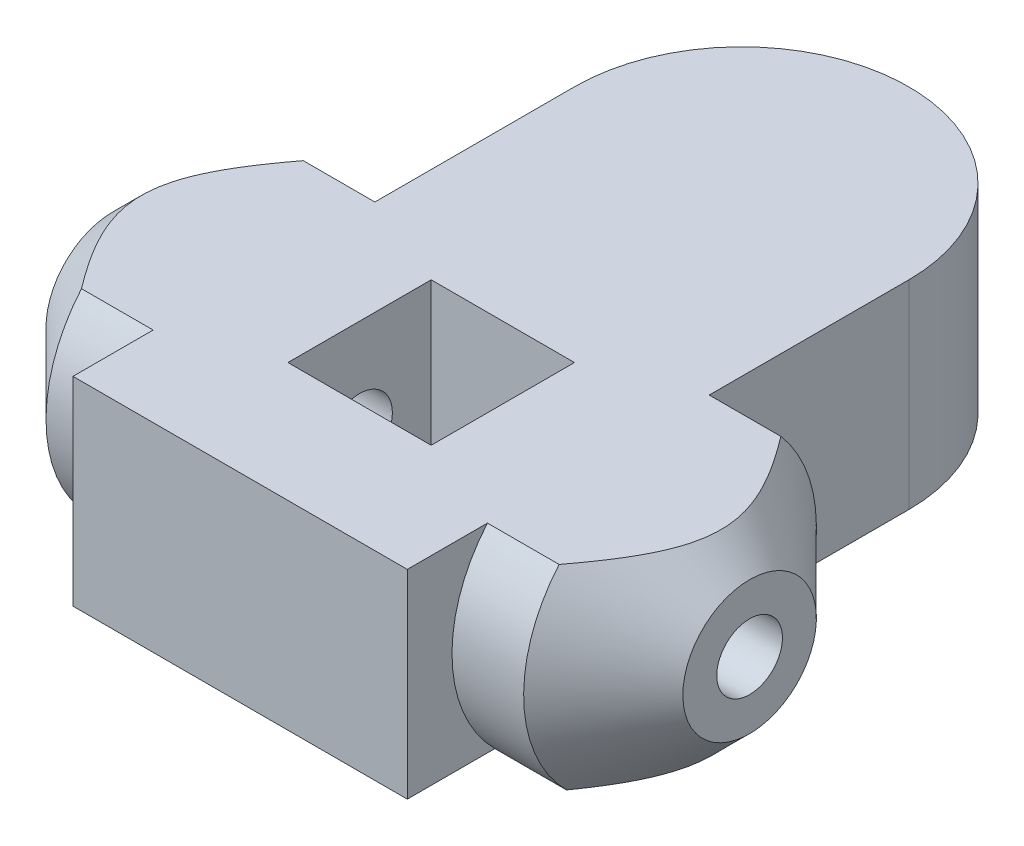
ISO-10303-21;
HEADER;
FILE_DESCRIPTION(('STEP AP214'),'2;1');
FILE_NAME('part.step','',(''),(''),'','','');
FILE_SCHEMA(('AUTOMOTIVE_DESIGN { 1 0 10303 214 1 1 1 1 }'));
ENDSEC;
DATA;
#1=APPLICATION_CONTEXT('core data for automotive mechanical design processes');
#2=APPLICATION_PROTOCOL_DEFINITION('international standard','automotive_design',2000,#1);
#3=PRODUCT_CONTEXT('',#1,'mechanical');
#4=PRODUCT('Part','Part','',(#3));
#5=PRODUCT_RELATED_PRODUCT_CATEGORY('part','',(#4));
#6=PRODUCT_DEFINITION_FORMATION('','',#4);
#7=PRODUCT_DEFINITION_CONTEXT('part definition',#1,'design');
#8=PRODUCT_DEFINITION('design','',#6,#7);
#9=PRODUCT_DEFINITION_SHAPE('','',#8);
#10=(LENGTH_UNIT() NAMED_UNIT(*) SI_UNIT(.MILLI.,.METRE.));
#11=(NAMED_UNIT(*) PLANE_ANGLE_UNIT() SI_UNIT($,.RADIAN.));
#12=(NAMED_UNIT(*) SI_UNIT($,.STERADIAN.) SOLID_ANGLE_UNIT());
#13=UNCERTAINTY_MEASURE_WITH_UNIT(LENGTH_MEASURE(1.E-05),#10,'distance_accuracy_value','');
#14=(GEOMETRIC_REPRESENTATION_CONTEXT(3) GLOBAL_UNCERTAINTY_ASSIGNED_CONTEXT((#13)) GLOBAL_UNIT_ASSIGNED_CONTEXT((#10,
#11,#12)) REPRESENTATION_CONTEXT('',''));
#15=CARTESIAN_POINT('',(0.,0.,0.));
#16=DIRECTION('',(0.,0.,1.));
#17=DIRECTION('',(1.,0.,0.));
#18=AXIS2_PLACEMENT_3D('',#15,#16,#17);
#19=CARTESIAN_POINT('',(21.,-13.,24.));
#20=DIRECTION('',(1.,0.,0.));
#21=DIRECTION('',(0.,0.,-1.));
#22=AXIS2_PLACEMENT_3D('',#19,#20,#21);
#23=PLANE('',#22);
#24=DIRECTION('',(0.,0.,-1.));
#25=VECTOR('',#24,1.);
#26=CARTESIAN_POINT('',(21.,12.,24.));
#27=LINE('',#26,#25);
#28=CARTESIAN_POINT('',(21.,12.,-13.9283882771844));
#29=VERTEX_POINT('',#28);
#30=CARTESIAN_POINT('',(21.,12.,-39.));
#31=VERTEX_POINT('',#30);
#32=EDGE_CURVE('E250',#29,#31,#27,.T.);
#33=ORIENTED_EDGE('',*,*,#32,.F.);
#34=CARTESIAN_POINT('',(21.,0.,0.));
#35=DIRECTION('',(1.,0.,0.));
#36=DIRECTION('',(0.,0.,-1.));
#37=AXIS2_PLACEMENT_3D('',#34,#35,#36);
#38=CIRCLE('',#37,18.3847763108505);
#39=CARTESIAN_POINT('',(21.,-13.,-13.0000000000003));
#40=VERTEX_POINT('',#39);
#41=EDGE_CURVE('E246',#29,#40,#38,.F.);
#42=ORIENTED_EDGE('',*,*,#41,.T.);
#43=DIRECTION('',(0.,0.,-1.));
#44=VECTOR('',#43,1.);
#45=CARTESIAN_POINT('',(21.,-13.,24.));
#46=LINE('',#45,#44);
#47=CARTESIAN_POINT('',(21.,-13.,-39.));
#48=VERTEX_POINT('',#47);
#49=EDGE_CURVE('E268',#40,#48,#46,.T.);
#50=ORIENTED_EDGE('',*,*,#49,.T.);
#51=DIRECTION('',(0.,1.,0.));
#52=VECTOR('',#51,1.);
#53=CARTESIAN_POINT('',(21.,-13.,-39.));
#54=LINE('',#53,#52);
#55=EDGE_CURVE('E286',#48,#31,#54,.T.);
#56=ORIENTED_EDGE('',*,*,#55,.T.);
#57=EDGE_LOOP('',(#33,#42,#50,#56));
#58=FACE_BOUND('',#57,.T.);
#59=ADVANCED_FACE('F43',(#58),#23,.T.);
#60=CARTESIAN_POINT('',(-21.,-13.,24.));
#61=DIRECTION('',(-1.,0.,0.));
#62=DIRECTION('',(0.,0.,1.));
#63=AXIS2_PLACEMENT_3D('',#60,#61,#62);
#64=PLANE('',#63);
#65=DIRECTION('',(0.,0.,1.));
#66=VECTOR('',#65,1.);
#67=CARTESIAN_POINT('',(-21.,-13.,24.));
#68=LINE('',#67,#66);
#69=CARTESIAN_POINT('',(-21.,-13.,-39.));
#70=VERTEX_POINT('',#69);
#71=CARTESIAN_POINT('',(-21.,-13.,-13.0000000000003));
#72=VERTEX_POINT('',#71);
#73=EDGE_CURVE('E278',#70,#72,#68,.T.);
#74=ORIENTED_EDGE('',*,*,#73,.T.);
#75=CARTESIAN_POINT('',(-21.,0.,0.));
#76=DIRECTION('',(-1.,0.,0.));
#77=DIRECTION('',(0.,0.,1.));
#78=AXIS2_PLACEMENT_3D('',#75,#76,#77);
#79=CIRCLE('',#78,18.3847763108505);
#80=CARTESIAN_POINT('',(-21.,12.,-13.9283882771844));
#81=VERTEX_POINT('',#80);
#82=EDGE_CURVE('E242',#72,#81,#79,.F.);
#83=ORIENTED_EDGE('',*,*,#82,.T.);
#84=DIRECTION('',(0.,0.,1.));
#85=VECTOR('',#84,1.);
#86=CARTESIAN_POINT('',(-21.,12.,24.));
#87=LINE('',#86,#85);
#88=CARTESIAN_POINT('',(-21.,12.,-39.));
#89=VERTEX_POINT('',#88);
#90=EDGE_CURVE('E260',#89,#81,#87,.T.);
#91=ORIENTED_EDGE('',*,*,#90,.F.);
#92=DIRECTION('',(0.,1.,0.));
#93=VECTOR('',#92,1.);
#94=CARTESIAN_POINT('',(-21.,-13.,-39.));
#95=LINE('',#94,#93);
#96=EDGE_CURVE('E294',#70,#89,#95,.T.);
#97=ORIENTED_EDGE('',*,*,#96,.F.);
#98=EDGE_LOOP('',(#74,#83,#91,#97));
#99=FACE_BOUND('',#98,.T.);
#100=ADVANCED_FACE('F345',(#99),#64,.T.);
#101=CARTESIAN_POINT('',(21.,-13.,24.));
#102=VERTEX_POINT('',#101);
#103=CARTESIAN_POINT('',(21.,-13.,13.0000000000003));
#104=VERTEX_POINT('',#103);
#105=EDGE_CURVE('E269',#102,#104,#46,.T.);
#106=ORIENTED_EDGE('',*,*,#105,.T.);
#107=CARTESIAN_POINT('',(21.,0.,0.));
#108=DIRECTION('',(1.,0.,0.));
#109=DIRECTION('',(0.,0.,-1.));
#110=AXIS2_PLACEMENT_3D('',#107,#108,#109);
#111=CIRCLE('',#110,18.3847763108505);
#112=CARTESIAN_POINT('',(21.,12.,13.9283882771844));
#113=VERTEX_POINT('',#112);
#114=EDGE_CURVE('E238',#104,#113,#111,.F.);
#115=ORIENTED_EDGE('',*,*,#114,.T.);
#116=CARTESIAN_POINT('',(21.,12.,24.));
#117=VERTEX_POINT('',#116);
#118=EDGE_CURVE('E251',#117,#113,#27,.T.);
#119=ORIENTED_EDGE('',*,*,#118,.F.);
#120=DIRECTION('',(0.,1.,0.));
#121=VECTOR('',#120,1.);
#122=CARTESIAN_POINT('',(21.,-13.,24.));
#123=LINE('',#122,#121);
#124=EDGE_CURVE('E287',#102,#117,#123,.T.);
#125=ORIENTED_EDGE('',*,*,#124,.F.);
#126=EDGE_LOOP('',(#106,#115,#119,#125));
#127=FACE_BOUND('',#126,.T.);
#128=ADVANCED_FACE('F340',(#127),#23,.T.);
#129=CARTESIAN_POINT('',(-21.,-13.,24.));
#130=DIRECTION('',(0.,0.,1.));
#131=DIRECTION('',(1.,0.,0.));
#132=AXIS2_PLACEMENT_3D('',#129,#130,#131);
#133=PLANE('',#132);
#134=ORIENTED_EDGE('',*,*,#124,.T.);
#135=DIRECTION('',(1.,0.,0.));
#136=VECTOR('',#135,1.);
#137=CARTESIAN_POINT('',(-21.,12.,24.));
#138=LINE('',#137,#136);
#139=CARTESIAN_POINT('',(-21.,12.,24.));
#140=VERTEX_POINT('',#139);
#141=EDGE_CURVE('E264',#140,#117,#138,.T.);
#142=ORIENTED_EDGE('',*,*,#141,.F.);
#143=DIRECTION('',(0.,1.,0.));
#144=VECTOR('',#143,1.);
#145=CARTESIAN_POINT('',(-21.,-13.,24.));
#146=LINE('',#145,#144);
#147=CARTESIAN_POINT('',(-21.,-13.,24.));
#148=VERTEX_POINT('',#147);
#149=EDGE_CURVE('E290',#148,#140,#146,.T.);
#150=ORIENTED_EDGE('',*,*,#149,.F.);
#151=DIRECTION('',(1.,0.,0.));
#152=VECTOR('',#151,1.);
#153=CARTESIAN_POINT('',(-21.,-13.,24.));
#154=LINE('',#153,#152);
#155=EDGE_CURVE('E282',#148,#102,#154,.T.);
#156=ORIENTED_EDGE('',*,*,#155,.T.);
#157=EDGE_LOOP('',(#134,#142,#150,#156));
#158=FACE_BOUND('',#157,.T.);
#159=ADVANCED_FACE('F335',(#158),#133,.T.);
#160=CARTESIAN_POINT('',(-21.,12.,13.9283882771844));
#161=VERTEX_POINT('',#160);
#162=EDGE_CURVE('E259',#161,#140,#87,.T.);
#163=ORIENTED_EDGE('',*,*,#162,.F.);
#164=CARTESIAN_POINT('',(-21.,0.,0.));
#165=DIRECTION('',(-1.,0.,0.));
#166=DIRECTION('',(0.,0.,1.));
#167=AXIS2_PLACEMENT_3D('',#164,#165,#166);
#168=CIRCLE('',#167,18.3847763108505);
#169=CARTESIAN_POINT('',(-21.,-13.,13.0000000000003));
#170=VERTEX_POINT('',#169);
#171=EDGE_CURVE('E234',#161,#170,#168,.F.);
#172=ORIENTED_EDGE('',*,*,#171,.T.);
#173=EDGE_CURVE('E277',#170,#148,#68,.T.);
#174=ORIENTED_EDGE('',*,*,#173,.T.);
#175=ORIENTED_EDGE('',*,*,#149,.T.);
#176=EDGE_LOOP('',(#163,#172,#174,#175));
#177=FACE_BOUND('',#176,.T.);
#178=ADVANCED_FACE('F339',(#177),#64,.T.);
#179=CARTESIAN_POINT('',(0.,-13.,-39.));
#180=DIRECTION('',(0.,1.,0.));
#181=DIRECTION('',(0.,0.,1.));
#182=AXIS2_PLACEMENT_3D('',#179,#180,#181);
#183=CYLINDRICAL_SURFACE('',#182,21.);
#184=ORIENTED_EDGE('',*,*,#96,.T.);
#185=CARTESIAN_POINT('',(0.,12.,-39.));
#186=DIRECTION('',(0.,1.,0.));
#187=DIRECTION('',(0.,0.,1.));
#188=AXIS2_PLACEMENT_3D('',#185,#186,#187);
#189=CIRCLE('',#188,21.);
#190=EDGE_CURVE('E255',#31,#89,#189,.T.);
#191=ORIENTED_EDGE('',*,*,#190,.F.);
#192=ORIENTED_EDGE('',*,*,#55,.F.);
#193=CARTESIAN_POINT('',(0.,-13.,-39.));
#194=DIRECTION('',(0.,1.,0.));
#195=DIRECTION('',(0.,0.,1.));
#196=AXIS2_PLACEMENT_3D('',#193,#194,#195);
#197=CIRCLE('',#196,21.);
#198=EDGE_CURVE('E273',#48,#70,#197,.T.);
#199=ORIENTED_EDGE('',*,*,#198,.T.);
#200=EDGE_LOOP('',(#184,#191,#192,#199));
#201=FACE_BOUND('',#200,.T.);
#202=ADVANCED_FACE('F331',(#201),#183,.T.);
#203=CARTESIAN_POINT('',(0.,-13.,-39.));
#204=DIRECTION('',(0.,1.,0.));
#205=DIRECTION('',(0.,0.,1.));
#206=AXIS2_PLACEMENT_3D('',#203,#204,#205);
#207=PLANE('',#206);
#208=DIRECTION('',(-1.,0.,0.));
#209=VECTOR('',#208,1.);
#210=CARTESIAN_POINT('',(40.,-13.,-13.0000000000003));
#211=LINE('',#210,#209);
#212=CARTESIAN_POINT('',(29.9999999999999,-13.,-13.0000000000003));
#213=VERTEX_POINT('',#212);
#214=EDGE_CURVE('E231',#213,#40,#211,.T.);
#215=ORIENTED_EDGE('',*,*,#214,.F.);
#216=CARTESIAN_POINT('',(29.9999999999999,-13.,-13.0000000000003));
#217=CARTESIAN_POINT('',(30.1285065276517,-13.,-12.8182597189329));
#218=CARTESIAN_POINT('',(30.2561191394999,-13.,-12.6358879881555));
#219=CARTESIAN_POINT('',(30.5093773033593,-13.,-12.2697752499743));
#220=CARTESIAN_POINT('',(30.6350227896832,-13.,-12.0860341971464));
#221=CARTESIAN_POINT('',(31.0088314586741,-13.,-11.5324609145168));
#222=CARTESIAN_POINT('',(31.25375870935,-13.,-11.1604308949106));
#223=CARTESIAN_POINT('',(31.7361176955759,-13.,-10.4049705309283));
#224=CARTESIAN_POINT('',(31.9734177958351,-13.,-10.0214558630709));
#225=CARTESIAN_POINT('',(32.434786671612,-13.,-9.24657087540727));
#226=CARTESIAN_POINT('',(32.6588569652249,-13.,-8.85520146385075));
#227=CARTESIAN_POINT('',(33.0972296574377,-13.,-8.05145926409717));
#228=CARTESIAN_POINT('',(33.3110280144749,-13.,-7.63880966368275));
#229=CARTESIAN_POINT('',(33.7169680193847,-13.,-6.80280341373876));
#230=CARTESIAN_POINT('',(33.9091055590851,-13.,-6.37944475171703));
#231=CARTESIAN_POINT('',(34.2653689538084,-13.,-5.5234328995457));
#232=CARTESIAN_POINT('',(34.4296285970587,-13.,-5.09083600712471));
#233=CARTESIAN_POINT('',(34.7248824018153,-13.,-4.21456694695074));
#234=CARTESIAN_POINT('',(34.8558974367147,-13.,-3.77090192175787));
#235=CARTESIAN_POINT('',(35.0721635116771,-13.,-2.89739823079814));
#236=CARTESIAN_POINT('',(35.1594760737891,-13.,-2.46807725247808));
#237=CARTESIAN_POINT('',(35.2932960724229,-13.,-1.60290967781661));
#238=CARTESIAN_POINT('',(35.339795553934,-13.,-1.16706182613114));
#239=CARTESIAN_POINT('',(35.3884285530722,-13.,-0.299511233579166));
#240=CARTESIAN_POINT('',(35.3912263445886,-13.,0.132153675850127));
#241=CARTESIAN_POINT('',(35.3539653839037,-13.,0.993617129648628));
#242=CARTESIAN_POINT('',(35.3139047439034,-13.,1.4234155909685));
#243=CARTESIAN_POINT('',(35.1941616930827,-13.,2.27329484614641));
#244=CARTESIAN_POINT('',(35.1148480232691,-13.,2.69342870143072));
#245=CARTESIAN_POINT('',(34.9212917633065,-13.,3.52552312895587));
#246=CARTESIAN_POINT('',(34.8070457320013,-13.,3.93748289171462));
#247=CARTESIAN_POINT('',(34.6122099236903,-13.,4.55218551983212));
#248=CARTESIAN_POINT('',(34.5425733767573,-13.,4.75849754536857));
#249=CARTESIAN_POINT('',(34.3962800184364,-13.,5.1686278913515));
#250=CARTESIAN_POINT('',(34.3196231449197,-13.,5.37244618971079));
#251=CARTESIAN_POINT('',(34.1599767872289,-13.,5.77750552196208));
#252=CARTESIAN_POINT('',(34.0769892410351,-13.,5.97874732273005));
#253=CARTESIAN_POINT('',(33.9052786063024,-13.,6.3787509955619));
#254=CARTESIAN_POINT('',(33.8165557320282,-13.,6.57751295993887));
#255=CARTESIAN_POINT('',(33.5294012641891,-13.,7.19885745995095));
#256=CARTESIAN_POINT('',(33.3216612602138,-13.,7.61715698391067));
#257=CARTESIAN_POINT('',(32.8872050825841,-13.,8.4438375633031));
#258=CARTESIAN_POINT('',(32.6604827700448,-13.,8.85221535452713));
#259=CARTESIAN_POINT('',(32.1915943753494,-13.,9.6606245379244));
#260=CARTESIAN_POINT('',(31.9494100426597,-13.,10.060645298501));
#261=CARTESIAN_POINT('',(31.4528249235434,-13.,10.852936114874));
#262=CARTESIAN_POINT('',(31.1984253950053,-13.,11.2452069628889));
#263=CARTESIAN_POINT('',(30.6780668395618,-13.,12.0254970685278));
#264=CARTESIAN_POINT('',(30.4120459998478,-13.,12.4134749708161));
#265=CARTESIAN_POINT('',(29.871734856942,-13.,13.1836252806064));
#266=CARTESIAN_POINT('',(29.5974443770057,-13.,13.5657975637638));
#267=CARTESIAN_POINT('',(29.0421934710175,-13.,14.324889067061));
#268=CARTESIAN_POINT('',(28.7612373175356,-13.,14.7018114188381));
#269=CARTESIAN_POINT('',(28.1936086903415,-13.,15.4513121796751));
#270=CARTESIAN_POINT('',(27.9069362726914,-13.,15.823890631281));
#271=CARTESIAN_POINT('',(27.1058742559966,-13.,16.8511449925003));
#272=CARTESIAN_POINT('',(26.5863455469389,-13.,17.5018134866228));
#273=CARTESIAN_POINT('',(25.5358621900755,-13.,18.7939907504809));
#274=CARTESIAN_POINT('',(25.0049057283033,-13.,19.4354980387389));
#275=CARTESIAN_POINT('',(23.9412475518227,-13.,20.7027324429161));
#276=CARTESIAN_POINT('',(23.4086607280156,-13.,21.3285561282289));
#277=CARTESIAN_POINT('',(22.6047744405739,-13.,22.2628291625251));
#278=CARTESIAN_POINT('',(22.336013517469,-13.,22.5734693801987));
#279=CARTESIAN_POINT('',(21.7969702747539,-13.,23.193422344516));
#280=CARTESIAN_POINT('',(21.526687968761,-13.,23.5027351029977));
#281=CARTESIAN_POINT('',(21.2557274587989,-13.,23.8114529505655));
#282=B_SPLINE_CURVE_WITH_KNOTS('',3,(#216,#217,#218,#219,#220,#221,#222,#223,#224,#225,#226,
#227,#228,#229,#230,#231,#232,#233,#234,#235,#236,#237,#238,#239,#240,#241,#242,#243,#244,#245,
#246,#247,#248,#249,#250,#251,#252,#253,#254,#255,#256,#257,#258,#259,#260,#261,#262,#263,#264,
#265,#266,#267,#268,#269,#270,#271,#272,#273,#274,#275,#276,#277,#278,#279,#280,#281),
.UNSPECIFIED.,.F.,.F.,(4,2,2,2,2,2,2,2,2,2,2,2,2,2,2,2,2,2,2,2,2,2,2,2,2,2,2,2,2,2,2,2,4),(0.,
0.6677458241089,1.3355138985977,2.67161037119007,4.02437580430976,5.37698570725998,
6.77071615122797,8.16471048581235,9.55181318455473,10.9380427917938,12.2506259450982,
13.5634648814914,14.8563286615979,16.1492493912349,17.4302486617139,18.7113741629812,
19.3645139033757,20.0176594245113,20.6706057973688,21.3235277910247,22.7239767705443,
24.1248804182047,25.527469333509,26.9299141223922,28.3410412304497,29.7521985194937,
31.1624744974749,32.5727366509941,35.0704490711234,37.5685609291691,40.0338025046588,
41.2661006609545,42.4983878048957),.UNSPECIFIED.);
#283=CARTESIAN_POINT('',(30.,-13.,13.0000000000003));
#284=VERTEX_POINT('',#283);
#285=EDGE_CURVE('E319',#213,#284,#282,.T.);
#286=ORIENTED_EDGE('',*,*,#285,.T.);
#287=DIRECTION('',(-1.,0.,0.));
#288=VECTOR('',#287,1.);
#289=CARTESIAN_POINT('',(40.,-13.,13.0000000000003));
#290=LINE('',#289,#288);
#291=EDGE_CURVE('E219',#284,#104,#290,.T.);
#292=ORIENTED_EDGE('',*,*,#291,.T.);
#293=ORIENTED_EDGE('',*,*,#105,.F.);
#294=ORIENTED_EDGE('',*,*,#155,.F.);
#295=ORIENTED_EDGE('',*,*,#173,.F.);
#296=CARTESIAN_POINT('',(-30.,-13.,13.0000000000003));
#297=VERTEX_POINT('',#296);
#298=EDGE_CURVE('E213',#170,#297,#290,.T.);
#299=ORIENTED_EDGE('',*,*,#298,.T.);
#300=CARTESIAN_POINT('',(-30.,-13.,13.0000000000003));
#301=CARTESIAN_POINT('',(-30.1285065276517,-13.,12.8182597189329));
#302=CARTESIAN_POINT('',(-30.2561191394999,-13.,12.6358879881555));
#303=CARTESIAN_POINT('',(-30.5093773033593,-13.,12.2697752499743));
#304=CARTESIAN_POINT('',(-30.6350227896832,-13.,12.0860341971464));
#305=CARTESIAN_POINT('',(-31.0088314586742,-13.,11.5324609145168));
#306=CARTESIAN_POINT('',(-31.2537587093501,-13.,11.1604308949106));
#307=CARTESIAN_POINT('',(-31.736117695576,-13.,10.4049705309283));
#308=CARTESIAN_POINT('',(-31.9734177958352,-13.,10.0214558630709));
#309=CARTESIAN_POINT('',(-32.434786671612,-13.,9.24657087540727));
#310=CARTESIAN_POINT('',(-32.6588569652249,-13.,8.85520146385074));
#311=CARTESIAN_POINT('',(-33.0972296574378,-13.,8.05145926409716));
#312=CARTESIAN_POINT('',(-33.3110280144749,-13.,7.63880966368274));
#313=CARTESIAN_POINT('',(-33.7169680193848,-13.,6.80280341373876));
#314=CARTESIAN_POINT('',(-33.9091055590851,-13.,6.37944475171703));
#315=CARTESIAN_POINT('',(-34.2653689538085,-13.,5.5234328995457));
#316=CARTESIAN_POINT('',(-34.4296285970587,-13.,5.09083600712472));
#317=CARTESIAN_POINT('',(-34.7248824018154,-13.,4.21456694695074));
#318=CARTESIAN_POINT('',(-34.8558974367148,-13.,3.77090192175788));
#319=CARTESIAN_POINT('',(-35.0721635116772,-13.,2.89739823079814));
#320=CARTESIAN_POINT('',(-35.1594760737891,-13.,2.46807725247808));
#321=CARTESIAN_POINT('',(-35.293296072423,-13.,1.60290967781661));
#322=CARTESIAN_POINT('',(-35.3397955539341,-13.,1.16706182613113));
#323=CARTESIAN_POINT('',(-35.3884285530723,-13.,0.299511233579154));
#324=CARTESIAN_POINT('',(-35.3912263445886,-13.,-0.132153675850141));
#325=CARTESIAN_POINT('',(-35.3539653839037,-13.,-0.993617129648646));
#326=CARTESIAN_POINT('',(-35.3139047439035,-13.,-1.42341559096852));
#327=CARTESIAN_POINT('',(-35.1941616930827,-13.,-2.27329484614644));
#328=CARTESIAN_POINT('',(-35.1148480232691,-13.,-2.69342870143075));
#329=CARTESIAN_POINT('',(-34.9212917633065,-13.,-3.5255231289559));
#330=CARTESIAN_POINT('',(-34.8070457320013,-13.,-3.93748289171466));
#331=CARTESIAN_POINT('',(-34.6122099236903,-13.,-4.55218551983215));
#332=CARTESIAN_POINT('',(-34.5425733767573,-13.,-4.75849754536861));
#333=CARTESIAN_POINT('',(-34.3962800184364,-13.,-5.16862789135154));
#334=CARTESIAN_POINT('',(-34.3196231449197,-13.,-5.37244618971083));
#335=CARTESIAN_POINT('',(-34.1599767872289,-13.,-5.77750552196212));
#336=CARTESIAN_POINT('',(-34.0769892410352,-13.,-5.97874732273009));
#337=CARTESIAN_POINT('',(-33.9052786063024,-13.,-6.37875099556194));
#338=CARTESIAN_POINT('',(-33.8165557320282,-13.,-6.57751295993891));
#339=CARTESIAN_POINT('',(-33.5294012641891,-13.,-7.198857459951));
#340=CARTESIAN_POINT('',(-33.3216612602139,-13.,-7.61715698391073));
#341=CARTESIAN_POINT('',(-32.8872050825841,-13.,-8.44383756330316));
#342=CARTESIAN_POINT('',(-32.6604827700448,-13.,-8.85221535452721));
#343=CARTESIAN_POINT('',(-32.1915943753494,-13.,-9.66062453792448));
#344=CARTESIAN_POINT('',(-31.9494100426597,-13.,-10.0606452985011));
#345=CARTESIAN_POINT('',(-31.4528249235434,-13.,-10.8529361148741));
#346=CARTESIAN_POINT('',(-31.1984253950052,-13.,-11.245206962889));
#347=CARTESIAN_POINT('',(-30.6780668395617,-13.,-12.0254970685279));
#348=CARTESIAN_POINT('',(-30.4120459998478,-13.,-12.4134749708163));
#349=CARTESIAN_POINT('',(-29.8717348569419,-13.,-13.1836252806066));
#350=CARTESIAN_POINT('',(-29.5974443770056,-13.,-13.5657975637639));
#351=CARTESIAN_POINT('',(-29.0421934710174,-13.,-14.3248890670612));
#352=CARTESIAN_POINT('',(-28.7612373175356,-13.,-14.7018114188383));
#353=CARTESIAN_POINT('',(-28.1936086903414,-13.,-15.4513121796753));
#354=CARTESIAN_POINT('',(-27.9069362726913,-13.,-15.8238906312811));
#355=CARTESIAN_POINT('',(-27.1058742559965,-13.,-16.8511449925005));
#356=CARTESIAN_POINT('',(-26.5863455469388,-13.,-17.501813486623));
#357=CARTESIAN_POINT('',(-25.5358621900753,-13.,-18.7939907504811));
#358=CARTESIAN_POINT('',(-25.0049057283032,-13.,-19.4354980387391));
#359=CARTESIAN_POINT('',(-23.9412475518225,-13.,-20.7027324429164));
#360=CARTESIAN_POINT('',(-23.4086607280155,-13.,-21.3285561282292));
#361=CARTESIAN_POINT('',(-22.6047744405737,-13.,-22.2628291625254));
#362=CARTESIAN_POINT('',(-22.3360135174688,-13.,-22.573469380199));
#363=CARTESIAN_POINT('',(-21.7969702747537,-13.,-23.1934223445163));
#364=CARTESIAN_POINT('',(-21.5266879687608,-13.,-23.502735102998));
#365=CARTESIAN_POINT('',(-21.2557274587987,-13.,-23.8114529505658));
#366=B_SPLINE_CURVE_WITH_KNOTS('',3,(#300,#301,#302,#303,#304,#305,#306,#307,#308,#309,#310,
#311,#312,#313,#314,#315,#316,#317,#318,#319,#320,#321,#322,#323,#324,#325,#326,#327,#328,#329,
#330,#331,#332,#333,#334,#335,#336,#337,#338,#339,#340,#341,#342,#343,#344,#345,#346,#347,#348,
#349,#350,#351,#352,#353,#354,#355,#356,#357,#358,#359,#360,#361,#362,#363,#364,#365),
.UNSPECIFIED.,.F.,.F.,(4,2,2,2,2,2,2,2,2,2,2,2,2,2,2,2,2,2,2,2,2,2,2,2,2,2,2,2,2,2,2,2,4),(0.,
0.667745824108898,1.33551389859769,2.67161037119007,4.02437580430976,5.37698570725998,
6.77071615122797,8.16471048581234,9.55181318455472,10.9380427917938,12.2506259450982,
13.5634648814914,14.8563286615979,16.1492493912349,17.4302486617139,18.7113741629813,
19.3645139033757,20.0176594245113,20.6706057973689,21.3235277910248,22.7239767705444,
24.1248804182047,25.5274693335091,26.9299141223923,28.3410412304498,29.7521985194939,
31.1624744974751,32.5727366509943,35.0704490711237,37.5685609291695,40.0338025046592,
41.2661006609549,42.4983878048961),.UNSPECIFIED.);
#367=CARTESIAN_POINT('',(-30.,-13.,-13.0000000000003));
#368=VERTEX_POINT('',#367);
#369=EDGE_CURVE('E311',#297,#368,#366,.T.);
#370=ORIENTED_EDGE('',*,*,#369,.T.);
#371=EDGE_CURVE('E230',#72,#368,#211,.T.);
#372=ORIENTED_EDGE('',*,*,#371,.F.);
#373=ORIENTED_EDGE('',*,*,#73,.F.);
#374=ORIENTED_EDGE('',*,*,#198,.F.);
#375=ORIENTED_EDGE('',*,*,#49,.F.);
#376=EDGE_LOOP('',(#215,#286,#292,#293,#294,#295,#299,#370,#372,#373,#374,#375));
#377=FACE_BOUND('',#376,.T.);
#378=ADVANCED_FACE('F325',(#377),#207,.F.);
#379=CARTESIAN_POINT('',(0.,12.,-39.));
#380=DIRECTION('',(0.,1.,0.));
#381=DIRECTION('',(0.,0.,1.));
#382=AXIS2_PLACEMENT_3D('',#379,#380,#381);
#383=PLANE('',#382);
#384=DIRECTION('',(0.,0.,-1.));
#385=VECTOR('',#384,1.);
#386=CARTESIAN_POINT('',(9.,12.,-9.));
#387=LINE('',#386,#385);
#388=CARTESIAN_POINT('',(9.,12.,9.));
#389=VERTEX_POINT('',#388);
#390=CARTESIAN_POINT('',(9.,12.,-9.));
#391=VERTEX_POINT('',#390);
#392=EDGE_CURVE('E168',#389,#391,#387,.T.);
#393=ORIENTED_EDGE('',*,*,#392,.F.);
#394=DIRECTION('',(1.,0.,0.));
#395=VECTOR('',#394,1.);
#396=CARTESIAN_POINT('',(-8.99999999999999,12.,9.));
#397=LINE('',#396,#395);
#398=CARTESIAN_POINT('',(-8.99999999999999,12.,9.));
#399=VERTEX_POINT('',#398);
#400=EDGE_CURVE('E188',#399,#389,#397,.T.);
#401=ORIENTED_EDGE('',*,*,#400,.F.);
#402=DIRECTION('',(0.,0.,1.));
#403=VECTOR('',#402,1.);
#404=CARTESIAN_POINT('',(-9.,12.,-9.));
#405=LINE('',#404,#403);
#406=CARTESIAN_POINT('',(-9.,12.,-9.));
#407=VERTEX_POINT('',#406);
#408=EDGE_CURVE('E192',#407,#399,#405,.T.);
#409=ORIENTED_EDGE('',*,*,#408,.F.);
#410=DIRECTION('',(-1.,0.,0.));
#411=VECTOR('',#410,1.);
#412=CARTESIAN_POINT('',(-9.,12.,-9.));
#413=LINE('',#412,#411);
#414=EDGE_CURVE('E204',#391,#407,#413,.T.);
#415=ORIENTED_EDGE('',*,*,#414,.F.);
#416=EDGE_LOOP('',(#393,#401,#409,#415));
#417=FACE_BOUND('',#416,.T.);
#418=DIRECTION('',(-1.,0.,0.));
#419=VECTOR('',#418,1.);
#420=CARTESIAN_POINT('',(40.,12.,13.9283882771844));
#421=LINE('',#420,#419);
#422=CARTESIAN_POINT('',(29.9999999999999,12.,13.9283882771844));
#423=VERTEX_POINT('',#422);
#424=EDGE_CURVE('E223',#423,#113,#421,.T.);
#425=ORIENTED_EDGE('',*,*,#424,.F.);
#426=CARTESIAN_POINT('',(30.,12.,13.9283882771844));
#427=CARTESIAN_POINT('',(30.1320092639601,12.,13.7541393472663));
#428=CARTESIAN_POINT('',(30.263351220415,12.,13.5793852664909));
#429=CARTESIAN_POINT('',(30.5245704639158,12.,13.2287807452682));
#430=CARTESIAN_POINT('',(30.6544477220432,12.,13.0529302832804));
#431=CARTESIAN_POINT('',(31.0417464254501,12.,12.5235242048632));
#432=CARTESIAN_POINT('',(31.296766306831,12.,12.1682040376017));
#433=CARTESIAN_POINT('',(31.8013203578912,12.,11.4489004680574));
#434=CARTESIAN_POINT('',(32.0507846083522,12.,11.0848679021244));
#435=CARTESIAN_POINT('',(32.5400480247387,12.,10.35038390713));
#436=CARTESIAN_POINT('',(32.7798479402958,12.,9.97993297912014));
#437=CARTESIAN_POINT('',(33.261730377917,12.,9.20883266884756));
#438=CARTESIAN_POINT('',(33.5030679269766,12.,8.80771515589817));
#439=CARTESIAN_POINT('',(33.968839764259,12.,7.99561780193252));
#440=CARTESIAN_POINT('',(34.1932709317923,12.,7.58463615850255));
#441=CARTESIAN_POINT('',(34.6197726228804,12.,6.75295083065008));
#442=CARTESIAN_POINT('',(34.821918700601,12.,6.3322862328624));
#443=CARTESIAN_POINT('',(35.1987162852706,12.,5.47892009184937));
#444=CARTESIAN_POINT('',(35.3733823014943,12.,5.04622504359457));
#445=CARTESIAN_POINT('',(35.6797477434871,12.,4.19146222367522));
#446=CARTESIAN_POINT('',(35.8132294612944,12.,3.77004047041727));
#447=CARTESIAN_POINT('',(36.0422149621458,12.,2.91672162607253));
#448=CARTESIAN_POINT('',(36.1377195468684,12.,2.48482475631449));
#449=CARTESIAN_POINT('',(36.246961094451,12.,1.8360099550116));
#450=CARTESIAN_POINT('',(36.2775545110229,12.,1.62185092503386));
#451=CARTESIAN_POINT('',(36.3275794632153,12.,1.1922437053847));
#452=CARTESIAN_POINT('',(36.347012703671,12.,0.976795717698742));
#453=CARTESIAN_POINT('',(36.3743304182905,12.,0.545170164890772));
#454=CARTESIAN_POINT('',(36.3822149779832,12.,0.328992605183808));
#455=CARTESIAN_POINT('',(36.3862781168794,12.,-0.103474510977066));
#456=CARTESIAN_POINT('',(36.3824566740231,12.,-0.319764067641268));
#457=CARTESIAN_POINT('',(36.3631822234442,12.,-0.751884491926325));
#458=CARTESIAN_POINT('',(36.3477258237286,12.,-0.967715207374398));
#459=CARTESIAN_POINT('',(36.305484289447,12.,-1.39828901740156));
#460=CARTESIAN_POINT('',(36.2786975333754,12.,-1.61303195185337));
#461=CARTESIAN_POINT('',(36.2143004456951,12.,-2.04088448386466));
#462=CARTESIAN_POINT('',(36.1766900947964,12.,-2.2539940785125));
#463=CARTESIAN_POINT('',(36.091304956503,12.,-2.67817820031776));
#464=CARTESIAN_POINT('',(36.0435284650599,12.,-2.88925238009104));
#465=CARTESIAN_POINT('',(35.8836508060866,12.,-3.52857649101108));
#466=CARTESIAN_POINT('',(35.756523976109,12.,-3.95314759310844));
#467=CARTESIAN_POINT('',(35.5414952194913,12.,-4.58134148841923));
#468=CARTESIAN_POINT('',(35.4657603905778,12.,-4.78930065965881));
#469=CARTESIAN_POINT('',(35.3069747920203,12.,-5.20242176246134));
#470=CARTESIAN_POINT('',(35.2239239117992,12.,-5.40758365169115));
#471=CARTESIAN_POINT('',(34.9117272829271,12.,-6.14465831098116));
#472=CARTESIAN_POINT('',(34.6634870737167,12.,-6.66852373394562));
#473=CARTESIAN_POINT('',(34.1339955526418,12.,-7.69938147340147));
#474=CARTESIAN_POINT('',(33.8527212570418,12.,-8.20636172331714));
#475=CARTESIAN_POINT('',(33.2646183921131,12.,-9.20782030445726));
#476=CARTESIAN_POINT('',(32.9576948557258,12.,-9.70224246016029));
#477=CARTESIAN_POINT('',(32.3254803352444,12.,-10.6789244294034));
#478=CARTESIAN_POINT('',(32.0001941360077,12.,-11.1611873643865));
#479=CARTESIAN_POINT('',(31.3624041594576,12.,-12.0772590520029));
#480=CARTESIAN_POINT('',(31.0509934541848,12.,-12.5118327392592));
#481=CARTESIAN_POINT('',(30.4187019738486,12.,-13.374069175135));
#482=CARTESIAN_POINT('',(30.09782042687,12.,-13.8017313560158));
#483=CARTESIAN_POINT('',(29.4514718822388,12.,-14.6473070242583));
#484=CARTESIAN_POINT('',(29.1260748546595,12.,-15.0652741124703));
#485=CARTESIAN_POINT('',(28.6334527626396,12.,-15.688560609936));
#486=CARTESIAN_POINT('',(28.4685092496652,12.,-15.895689646898));
#487=CARTESIAN_POINT('',(28.137237709248,12.,-16.3088330994354));
#488=CARTESIAN_POINT('',(27.9709097010397,12.,-16.5148475304303));
#489=CARTESIAN_POINT('',(27.8039549715613,12.,-16.7203530764077));
#490=B_SPLINE_CURVE_WITH_KNOTS('',3,(#426,#427,#428,#429,#430,#431,#432,#433,#434,#435,#436,
#437,#438,#439,#440,#441,#442,#443,#444,#445,#446,#447,#448,#449,#450,#451,#452,#453,#454,#455,
#456,#457,#458,#459,#460,#461,#462,#463,#464,#465,#466,#467,#468,#469,#470,#471,#472,#473,#474,
#475,#476,#477,#478,#479,#480,#481,#482,#483,#484,#485,#486,#487,#488,#489),.UNSPECIFIED.,.F.,
.F.,(4,2,2,2,2,2,2,2,2,2,2,2,2,2,2,2,2,2,2,2,2,2,2,2,2,2,2,2,2,2,2,4),(0.,0.655818829447419,
1.3116505845779,2.62365368250305,3.94745063794576,5.27114471226604,6.67518636703207,
8.07948655704756,9.47886891379324,10.8775099090059,12.2022686047511,13.5269993340125,
14.175754711424,14.8244109581962,15.4730624010413,16.1217150662708,16.7705569094902,
17.4194916409437,18.0684275289416,18.7174722773706,20.0451430190134,20.7090109869218,
21.3728889904612,23.1101965799366,24.8487201571525,26.593992991638,28.3388131316359,
29.9425546935622,31.5464273303886,33.1354490240736,33.9297862425738,34.7241124438666),.UNSPECIFIED.);
#491=CARTESIAN_POINT('',(30.,12.,-13.9283882771844));
#492=VERTEX_POINT('',#491);
#493=EDGE_CURVE('E361',#423,#492,#490,.T.);
#494=ORIENTED_EDGE('',*,*,#493,.T.);
#495=DIRECTION('',(-1.,0.,0.));
#496=VECTOR('',#495,1.);
#497=CARTESIAN_POINT('',(40.,12.,-13.9283882771844));
#498=LINE('',#497,#496);
#499=EDGE_CURVE('E227',#492,#29,#498,.T.);
#500=ORIENTED_EDGE('',*,*,#499,.T.);
#501=ORIENTED_EDGE('',*,*,#32,.T.);
#502=ORIENTED_EDGE('',*,*,#190,.T.);
#503=ORIENTED_EDGE('',*,*,#90,.T.);
#504=CARTESIAN_POINT('',(-30.,12.,-13.9283882771844));
#505=VERTEX_POINT('',#504);
#506=EDGE_CURVE('E226',#81,#505,#498,.T.);
#507=ORIENTED_EDGE('',*,*,#506,.T.);
#508=CARTESIAN_POINT('',(-30.,12.,-13.9283882771844));
#509=CARTESIAN_POINT('',(-30.1320092639602,12.,-13.7541393472663));
#510=CARTESIAN_POINT('',(-30.263351220415,12.,-13.5793852664909));
#511=CARTESIAN_POINT('',(-30.5245704639158,12.,-13.2287807452682));
#512=CARTESIAN_POINT('',(-30.6544477220432,12.,-13.0529302832804));
#513=CARTESIAN_POINT('',(-31.0417464254502,12.,-12.5235242048632));
#514=CARTESIAN_POINT('',(-31.2967663068311,12.,-12.1682040376017));
#515=CARTESIAN_POINT('',(-31.8013203578913,12.,-11.4489004680574));
#516=CARTESIAN_POINT('',(-32.0507846083522,12.,-11.0848679021244));
#517=CARTESIAN_POINT('',(-32.5400480247387,12.,-10.35038390713));
#518=CARTESIAN_POINT('',(-32.7798479402959,12.,-9.97993297912013));
#519=CARTESIAN_POINT('',(-33.261730377917,12.,-9.20883266884756));
#520=CARTESIAN_POINT('',(-33.5030679269767,12.,-8.80771515589816));
#521=CARTESIAN_POINT('',(-33.968839764259,12.,-7.99561780193252));
#522=CARTESIAN_POINT('',(-34.1932709317923,12.,-7.58463615850255));
#523=CARTESIAN_POINT('',(-34.6197726228805,12.,-6.75295083065008));
#524=CARTESIAN_POINT('',(-34.821918700601,12.,-6.3322862328624));
#525=CARTESIAN_POINT('',(-35.1987162852706,12.,-5.47892009184937));
#526=CARTESIAN_POINT('',(-35.3733823014944,12.,-5.04622504359457));
#527=CARTESIAN_POINT('',(-35.6797477434871,12.,-4.19146222367522));
#528=CARTESIAN_POINT('',(-35.8132294612944,12.,-3.77004047041726));
#529=CARTESIAN_POINT('',(-36.0422149621458,12.,-2.91672162607253));
#530=CARTESIAN_POINT('',(-36.1377195468684,12.,-2.48482475631448));
#531=CARTESIAN_POINT('',(-36.2469610944511,12.,-1.83600995501159));
#532=CARTESIAN_POINT('',(-36.277554511023,12.,-1.62185092503385));
#533=CARTESIAN_POINT('',(-36.3275794632154,12.,-1.19224370538469));
#534=CARTESIAN_POINT('',(-36.347012703671,12.,-0.976795717698729));
#535=CARTESIAN_POINT('',(-36.3743304182906,12.,-0.545170164890757));
#536=CARTESIAN_POINT('',(-36.3822149779832,12.,-0.328992605183792));
#537=CARTESIAN_POINT('',(-36.3862781168795,12.,0.103474510977085));
#538=CARTESIAN_POINT('',(-36.3824566740231,12.,0.319764067641287));
#539=CARTESIAN_POINT('',(-36.3631822234442,12.,0.751884491926346));
#540=CARTESIAN_POINT('',(-36.3477258237286,12.,0.967715207374419));
#541=CARTESIAN_POINT('',(-36.3054842894471,12.,1.39828901740158));
#542=CARTESIAN_POINT('',(-36.2786975333754,12.,1.61303195185339));
#543=CARTESIAN_POINT('',(-36.2143004456951,12.,2.04088448386469));
#544=CARTESIAN_POINT('',(-36.1766900947965,12.,2.25399407851253));
#545=CARTESIAN_POINT('',(-36.091304956503,12.,2.67817820031779));
#546=CARTESIAN_POINT('',(-36.0435284650599,12.,2.88925238009107));
#547=CARTESIAN_POINT('',(-35.8836508060867,12.,3.52857649101111));
#548=CARTESIAN_POINT('',(-35.756523976109,12.,3.95314759310847));
#549=CARTESIAN_POINT('',(-35.5414952194913,12.,4.58134148841927));
#550=CARTESIAN_POINT('',(-35.4657603905778,12.,4.78930065965885));
#551=CARTESIAN_POINT('',(-35.3069747920203,12.,5.20242176246138));
#552=CARTESIAN_POINT('',(-35.2239239117992,12.,5.40758365169119));
#553=CARTESIAN_POINT('',(-34.9117272829271,12.,6.14465831098121));
#554=CARTESIAN_POINT('',(-34.6634870737167,12.,6.66852373394568));
#555=CARTESIAN_POINT('',(-34.1339955526418,12.,7.69938147340155));
#556=CARTESIAN_POINT('',(-33.8527212570417,12.,8.20636172331722));
#557=CARTESIAN_POINT('',(-33.264618392113,12.,9.20782030445736));
#558=CARTESIAN_POINT('',(-32.9576948557258,12.,9.70224246016039));
#559=CARTESIAN_POINT('',(-32.3254803352444,12.,10.6789244294036));
#560=CARTESIAN_POINT('',(-32.0001941360077,12.,11.1611873643866));
#561=CARTESIAN_POINT('',(-31.3624041594575,12.,12.0772590520031));
#562=CARTESIAN_POINT('',(-31.0509934541847,12.,12.5118327392594));
#563=CARTESIAN_POINT('',(-30.4187019738485,12.,13.3740691751352));
#564=CARTESIAN_POINT('',(-30.0978204268699,12.,13.801731356016));
#565=CARTESIAN_POINT('',(-29.4514718822387,12.,14.6473070242585));
#566=CARTESIAN_POINT('',(-29.1260748546594,12.,15.0652741124705));
#567=CARTESIAN_POINT('',(-28.6334527626395,12.,15.6885606099362));
#568=CARTESIAN_POINT('',(-28.4685092496651,12.,15.8956896468982));
#569=CARTESIAN_POINT('',(-28.1372377092479,12.,16.3088330994356));
#570=CARTESIAN_POINT('',(-27.9709097010396,12.,16.5148475304305));
#571=CARTESIAN_POINT('',(-27.8039549715612,12.,16.7203530764079));
#572=B_SPLINE_CURVE_WITH_KNOTS('',3,(#508,#509,#510,#511,#512,#513,#514,#515,#516,#517,#518,
#519,#520,#521,#522,#523,#524,#525,#526,#527,#528,#529,#530,#531,#532,#533,#534,#535,#536,#537,
#538,#539,#540,#541,#542,#543,#544,#545,#546,#547,#548,#549,#550,#551,#552,#553,#554,#555,#556,
#557,#558,#559,#560,#561,#562,#563,#564,#565,#566,#567,#568,#569,#570,#571),.UNSPECIFIED.,.F.,
.F.,(4,2,2,2,2,2,2,2,2,2,2,2,2,2,2,2,2,2,2,2,2,2,2,2,2,2,2,2,2,2,2,4),(0.,0.655818829447419,
1.3116505845779,2.62365368250305,3.94745063794576,5.27114471226604,6.67518636703206,
8.07948655704755,9.47886891379323,10.8775099090059,12.2022686047511,13.5269993340125,
14.175754711424,14.8244109581962,15.4730624010413,16.1217150662708,16.7705569094903,
17.4194916409438,18.0684275289416,18.7174722773706,20.0451430190134,20.7090109869219,
21.3728889904613,23.1101965799367,24.8487201571526,26.5939929916381,28.338813131636,
29.9425546935624,31.5464273303888,33.1354490240738,33.929786242574,34.7241124438668),.UNSPECIFIED.);
#573=CARTESIAN_POINT('',(-30.,12.,13.9283882771844));
#574=VERTEX_POINT('',#573);
#575=EDGE_CURVE('E370',#505,#574,#572,.T.);
#576=ORIENTED_EDGE('',*,*,#575,.T.);
#577=EDGE_CURVE('E222',#161,#574,#421,.T.);
#578=ORIENTED_EDGE('',*,*,#577,.F.);
#579=ORIENTED_EDGE('',*,*,#162,.T.);
#580=ORIENTED_EDGE('',*,*,#141,.T.);
#581=ORIENTED_EDGE('',*,*,#118,.T.);
#582=EDGE_LOOP('',(#425,#494,#500,#501,#502,#503,#507,#576,#578,#579,#580,#581));
#583=FACE_BOUND('',#582,.T.);
#584=ADVANCED_FACE('F330',(#417,#583),#383,.T.);
#585=CARTESIAN_POINT('',(-40.,0.,0.));
#586=DIRECTION('',(1.,0.,0.));
#587=DIRECTION('',(0.,0.,-1.));
#588=AXIS2_PLACEMENT_3D('',#585,#586,#587);
#589=PLANE('',#588);
#590=CARTESIAN_POINT('',(-40.,0.,0.));
#591=DIRECTION('',(1.,0.,0.));
#592=DIRECTION('',(0.,0.,-1.));
#593=AXIS2_PLACEMENT_3D('',#590,#591,#592);
#594=CIRCLE('',#593,8.38477631085044);
#595=CARTESIAN_POINT('',(-40.,-5.92893218813459,-5.92893218813474));
#596=VERTEX_POINT('',#595);
#597=EDGE_CURVE('E11',#596,#596,#594,.F.);
#598=ORIENTED_EDGE('',*,*,#597,.T.);
#599=EDGE_LOOP('',(#598));
#600=FACE_BOUND('',#599,.T.);
#601=CARTESIAN_POINT('',(-40.,0.,0.));
#602=DIRECTION('',(1.,0.,0.));
#603=DIRECTION('',(0.,0.,-1.));
#604=AXIS2_PLACEMENT_3D('',#601,#602,#603);
#605=CIRCLE('',#604,4.125);
#606=CARTESIAN_POINT('',(-40.,0.,-4.125));
#607=VERTEX_POINT('',#606);
#608=EDGE_CURVE('E304',#607,#607,#605,.T.);
#609=ORIENTED_EDGE('',*,*,#608,.T.);
#610=EDGE_LOOP('',(#609));
#611=FACE_BOUND('',#610,.T.);
#612=ADVANCED_FACE('F541',(#600,#611),#589,.F.);
#613=CARTESIAN_POINT('',(40.,0.,0.));
#614=DIRECTION('',(-1.,0.,0.));
#615=DIRECTION('',(0.,0.,1.));
#616=AXIS2_PLACEMENT_3D('',#613,#614,#615);
#617=CYLINDRICAL_SURFACE('',#616,18.3847763108505);
#618=ORIENTED_EDGE('',*,*,#577,.T.);
#619=CARTESIAN_POINT('',(-30.,0.,0.));
#620=DIRECTION('',(1.,0.,0.));
#621=DIRECTION('',(0.,0.,-1.));
#622=AXIS2_PLACEMENT_3D('',#619,#620,#621);
#623=CIRCLE('',#622,18.3847763108505);
#624=EDGE_CURVE('E54',#574,#297,#623,.T.);
#625=ORIENTED_EDGE('',*,*,#624,.T.);
#626=ORIENTED_EDGE('',*,*,#298,.F.);
#627=ORIENTED_EDGE('',*,*,#171,.F.);
#628=EDGE_LOOP('',(#618,#625,#626,#627));
#629=FACE_BOUND('',#628,.T.);
#630=ADVANCED_FACE('F382',(#629),#617,.T.);
#631=ORIENTED_EDGE('',*,*,#371,.T.);
#632=CARTESIAN_POINT('',(-30.,0.,0.));
#633=DIRECTION('',(1.,0.,0.));
#634=DIRECTION('',(0.,0.,-1.));
#635=AXIS2_PLACEMENT_3D('',#632,#633,#634);
#636=CIRCLE('',#635,18.3847763108505);
#637=EDGE_CURVE('E369',#368,#505,#636,.T.);
#638=ORIENTED_EDGE('',*,*,#637,.T.);
#639=ORIENTED_EDGE('',*,*,#506,.F.);
#640=ORIENTED_EDGE('',*,*,#82,.F.);
#641=EDGE_LOOP('',(#631,#638,#639,#640));
#642=FACE_BOUND('',#641,.T.);
#643=ADVANCED_FACE('F395',(#642),#617,.T.);
#644=ORIENTED_EDGE('',*,*,#499,.F.);
#645=CARTESIAN_POINT('',(29.9999999999999,0.,0.));
#646=DIRECTION('',(1.,0.,0.));
#647=DIRECTION('',(0.,0.,-1.));
#648=AXIS2_PLACEMENT_3D('',#645,#646,#647);
#649=CIRCLE('',#648,18.3847763108505);
#650=EDGE_CURVE('E307',#492,#213,#649,.F.);
#651=ORIENTED_EDGE('',*,*,#650,.T.);
#652=ORIENTED_EDGE('',*,*,#214,.T.);
#653=ORIENTED_EDGE('',*,*,#41,.F.);
#654=EDGE_LOOP('',(#644,#651,#652,#653));
#655=FACE_BOUND('',#654,.T.);
#656=ADVANCED_FACE('F420',(#655),#617,.T.);
#657=ORIENTED_EDGE('',*,*,#291,.F.);
#658=CARTESIAN_POINT('',(30.,0.,0.));
#659=DIRECTION('',(-1.,0.,0.));
#660=DIRECTION('',(0.,0.,1.));
#661=AXIS2_PLACEMENT_3D('',#658,#659,#660);
#662=CIRCLE('',#661,18.3847763108505);
#663=EDGE_CURVE('E408',#284,#423,#662,.T.);
#664=ORIENTED_EDGE('',*,*,#663,.T.);
#665=ORIENTED_EDGE('',*,*,#424,.T.);
#666=ORIENTED_EDGE('',*,*,#114,.F.);
#667=EDGE_LOOP('',(#657,#664,#665,#666));
#668=FACE_BOUND('',#667,.T.);
#669=ADVANCED_FACE('F413',(#668),#617,.T.);
#670=CARTESIAN_POINT('',(40.,0.,0.));
#671=DIRECTION('',(1.,0.,0.));
#672=DIRECTION('',(0.,0.,-1.));
#673=AXIS2_PLACEMENT_3D('',#670,#671,#672);
#674=PLANE('',#673);
#675=CARTESIAN_POINT('',(40.,0.,0.));
#676=DIRECTION('',(1.,0.,0.));
#677=DIRECTION('',(0.,0.,-1.));
#678=AXIS2_PLACEMENT_3D('',#675,#676,#677);
#679=CIRCLE('',#678,8.38477631085043);
#680=CARTESIAN_POINT('',(40.,-5.92893218813459,-5.92893218813473));
#681=VERTEX_POINT('',#680);
#682=EDGE_CURVE('E62',#681,#681,#679,.T.);
#683=ORIENTED_EDGE('',*,*,#682,.T.);
#684=EDGE_LOOP('',(#683));
#685=FACE_BOUND('',#684,.T.);
#686=CARTESIAN_POINT('',(40.,0.,0.));
#687=DIRECTION('',(1.,0.,0.));
#688=DIRECTION('',(0.,0.,-1.));
#689=AXIS2_PLACEMENT_3D('',#686,#687,#688);
#690=CIRCLE('',#689,4.125);
#691=CARTESIAN_POINT('',(40.,0.,-4.125));
#692=VERTEX_POINT('',#691);
#693=EDGE_CURVE('E604',#692,#692,#690,.T.);
#694=ORIENTED_EDGE('',*,*,#693,.F.);
#695=EDGE_LOOP('',(#694));
#696=FACE_BOUND('',#695,.T.);
#697=ADVANCED_FACE('F500',(#685,#696),#674,.T.);
#698=CARTESIAN_POINT('',(9.,-8.,-9.));
#699=DIRECTION('',(1.,0.,0.));
#700=DIRECTION('',(0.,0.,-1.));
#701=AXIS2_PLACEMENT_3D('',#698,#699,#700);
#702=PLANE('',#701);
#703=CARTESIAN_POINT('',(9.,0.,0.));
#704=DIRECTION('',(1.,0.,0.));
#705=DIRECTION('',(0.,0.,-1.));
#706=AXIS2_PLACEMENT_3D('',#703,#704,#705);
#707=CIRCLE('',#706,4.125);
#708=CARTESIAN_POINT('',(9.,0.,-4.125));
#709=VERTEX_POINT('',#708);
#710=EDGE_CURVE('E195',#709,#709,#707,.T.);
#711=ORIENTED_EDGE('',*,*,#710,.T.);
#712=EDGE_LOOP('',(#711));
#713=FACE_BOUND('',#712,.T.);
#714=ORIENTED_EDGE('',*,*,#392,.T.);
#715=DIRECTION('',(0.,1.,0.));
#716=VECTOR('',#715,1.);
#717=CARTESIAN_POINT('',(9.,-8.,-9.));
#718=LINE('',#717,#716);
#719=CARTESIAN_POINT('',(9.,-8.,-9.));
#720=VERTEX_POINT('',#719);
#721=EDGE_CURVE('E161',#720,#391,#718,.T.);
#722=ORIENTED_EDGE('',*,*,#721,.F.);
#723=DIRECTION('',(0.,0.,-1.));
#724=VECTOR('',#723,1.);
#725=CARTESIAN_POINT('',(9.,-8.,-9.));
#726=LINE('',#725,#724);
#727=CARTESIAN_POINT('',(9.,-8.,9.));
#728=VERTEX_POINT('',#727);
#729=EDGE_CURVE('E165',#728,#720,#726,.T.);
#730=ORIENTED_EDGE('',*,*,#729,.F.);
#731=DIRECTION('',(0.,1.,0.));
#732=VECTOR('',#731,1.);
#733=CARTESIAN_POINT('',(9.,-8.,9.));
#734=LINE('',#733,#732);
#735=EDGE_CURVE('E210',#728,#389,#734,.T.);
#736=ORIENTED_EDGE('',*,*,#735,.T.);
#737=EDGE_LOOP('',(#714,#722,#730,#736));
#738=FACE_BOUND('',#737,.T.);
#739=ADVANCED_FACE('F163',(#713,#738),#702,.F.);
#740=CARTESIAN_POINT('',(-8.99999999999999,-8.,9.));
#741=DIRECTION('',(0.,0.,1.));
#742=DIRECTION('',(1.,0.,0.));
#743=AXIS2_PLACEMENT_3D('',#740,#741,#742);
#744=PLANE('',#743);
#745=ORIENTED_EDGE('',*,*,#400,.T.);
#746=ORIENTED_EDGE('',*,*,#735,.F.);
#747=DIRECTION('',(1.,0.,0.));
#748=VECTOR('',#747,1.);
#749=CARTESIAN_POINT('',(-8.99999999999999,-8.,9.));
#750=LINE('',#749,#748);
#751=CARTESIAN_POINT('',(-8.99999999999999,-8.,9.));
#752=VERTEX_POINT('',#751);
#753=EDGE_CURVE('E174',#752,#728,#750,.T.);
#754=ORIENTED_EDGE('',*,*,#753,.F.);
#755=DIRECTION('',(0.,1.,0.));
#756=VECTOR('',#755,1.);
#757=CARTESIAN_POINT('',(-8.99999999999999,-8.,9.));
#758=LINE('',#757,#756);
#759=EDGE_CURVE('E214',#752,#399,#758,.T.);
#760=ORIENTED_EDGE('',*,*,#759,.T.);
#761=EDGE_LOOP('',(#745,#746,#754,#760));
#762=FACE_BOUND('',#761,.T.);
#763=ADVANCED_FACE('F464',(#762),#744,.F.);
#764=CARTESIAN_POINT('',(-9.,-8.,-9.));
#765=DIRECTION('',(-1.,0.,0.));
#766=DIRECTION('',(0.,0.,1.));
#767=AXIS2_PLACEMENT_3D('',#764,#765,#766);
#768=PLANE('',#767);
#769=CARTESIAN_POINT('',(-9.,0.,0.));
#770=DIRECTION('',(-1.,0.,0.));
#771=DIRECTION('',(0.,0.,1.));
#772=AXIS2_PLACEMENT_3D('',#769,#770,#771);
#773=CIRCLE('',#772,4.125);
#774=CARTESIAN_POINT('',(-9.,0.,4.125));
#775=VERTEX_POINT('',#774);
#776=EDGE_CURVE('E300',#775,#775,#773,.T.);
#777=ORIENTED_EDGE('',*,*,#776,.T.);
#778=EDGE_LOOP('',(#777));
#779=FACE_BOUND('',#778,.T.);
#780=ORIENTED_EDGE('',*,*,#408,.T.);
#781=ORIENTED_EDGE('',*,*,#759,.F.);
#782=DIRECTION('',(0.,0.,1.));
#783=VECTOR('',#782,1.);
#784=CARTESIAN_POINT('',(-9.,-8.,-9.));
#785=LINE('',#784,#783);
#786=CARTESIAN_POINT('',(-9.,-8.,-9.));
#787=VERTEX_POINT('',#786);
#788=EDGE_CURVE('E183',#787,#752,#785,.T.);
#789=ORIENTED_EDGE('',*,*,#788,.F.);
#790=DIRECTION('',(0.,1.,0.));
#791=VECTOR('',#790,1.);
#792=CARTESIAN_POINT('',(-9.,-8.,-9.));
#793=LINE('',#792,#791);
#794=EDGE_CURVE('E173',#787,#407,#793,.T.);
#795=ORIENTED_EDGE('',*,*,#794,.T.);
#796=EDGE_LOOP('',(#780,#781,#789,#795));
#797=FACE_BOUND('',#796,.T.);
#798=ADVANCED_FACE('F469',(#779,#797),#768,.F.);
#799=CARTESIAN_POINT('',(-9.,-8.,-9.));
#800=DIRECTION('',(0.,0.,-1.));
#801=DIRECTION('',(-1.,0.,0.));
#802=AXIS2_PLACEMENT_3D('',#799,#800,#801);
#803=PLANE('',#802);
#804=ORIENTED_EDGE('',*,*,#414,.T.);
#805=ORIENTED_EDGE('',*,*,#794,.F.);
#806=DIRECTION('',(-1.,0.,0.));
#807=VECTOR('',#806,1.);
#808=CARTESIAN_POINT('',(-9.,-8.,-9.));
#809=LINE('',#808,#807);
#810=EDGE_CURVE('E177',#720,#787,#809,.T.);
#811=ORIENTED_EDGE('',*,*,#810,.F.);
#812=ORIENTED_EDGE('',*,*,#721,.T.);
#813=EDGE_LOOP('',(#804,#805,#811,#812));
#814=FACE_BOUND('',#813,.T.);
#815=ADVANCED_FACE('F178',(#814),#803,.F.);
#816=CARTESIAN_POINT('',(0.,-8.,0.));
#817=DIRECTION('',(0.,1.,0.));
#818=DIRECTION('',(0.,0.,1.));
#819=AXIS2_PLACEMENT_3D('',#816,#817,#818);
#820=PLANE('',#819);
#821=ORIENTED_EDGE('',*,*,#729,.T.);
#822=ORIENTED_EDGE('',*,*,#810,.T.);
#823=ORIENTED_EDGE('',*,*,#788,.T.);
#824=ORIENTED_EDGE('',*,*,#753,.T.);
#825=EDGE_LOOP('',(#821,#822,#823,#824));
#826=FACE_BOUND('',#825,.T.);
#827=ADVANCED_FACE('F185',(#826),#820,.T.);
#828=CARTESIAN_POINT('',(-40.,0.,0.));
#829=DIRECTION('',(1.,0.,0.));
#830=DIRECTION('',(0.,0.,-1.));
#831=AXIS2_PLACEMENT_3D('',#828,#829,#830);
#832=CYLINDRICAL_SURFACE('',#831,4.125);
#833=ORIENTED_EDGE('',*,*,#608,.F.);
#834=EDGE_LOOP('',(#833));
#835=FACE_BOUND('',#834,.T.);
#836=ORIENTED_EDGE('',*,*,#776,.F.);
#837=EDGE_LOOP('',(#836));
#838=FACE_BOUND('',#837,.T.);
#839=ADVANCED_FACE('F491',(#835,#838),#832,.F.);
#840=ORIENTED_EDGE('',*,*,#693,.T.);
#841=EDGE_LOOP('',(#840));
#842=FACE_BOUND('',#841,.T.);
#843=ORIENTED_EDGE('',*,*,#710,.F.);
#844=EDGE_LOOP('',(#843));
#845=FACE_BOUND('',#844,.T.);
#846=ADVANCED_FACE('F357',(#842,#845),#832,.F.);
#847=CARTESIAN_POINT('',(40.,0.,0.));
#848=DIRECTION('',(-1.,0.,0.));
#849=DIRECTION('',(0.,0.,1.));
#850=AXIS2_PLACEMENT_3D('',#847,#848,#849);
#851=CONICAL_SURFACE('',#850,8.38477631085043,0.785398163397447);
#852=ORIENTED_EDGE('',*,*,#285,.F.);
#853=ORIENTED_EDGE('',*,*,#650,.F.);
#854=ORIENTED_EDGE('',*,*,#493,.F.);
#855=ORIENTED_EDGE('',*,*,#663,.F.);
#856=EDGE_LOOP('',(#852,#853,#854,#855));
#857=FACE_BOUND('',#856,.T.);
#858=ORIENTED_EDGE('',*,*,#682,.F.);
#859=EDGE_LOOP('',(#858));
#860=FACE_BOUND('',#859,.T.);
#861=ADVANCED_FACE('F352',(#857,#860),#851,.T.);
#862=CARTESIAN_POINT('',(-30.,0.,0.));
#863=DIRECTION('',(1.,0.,0.));
#864=DIRECTION('',(0.,0.,-1.));
#865=AXIS2_PLACEMENT_3D('',#862,#863,#864);
#866=CONICAL_SURFACE('',#865,18.3847763108505,0.78539816339745);
#867=ORIENTED_EDGE('',*,*,#597,.F.);
#868=EDGE_LOOP('',(#867));
#869=FACE_BOUND('',#868,.T.);
#870=ORIENTED_EDGE('',*,*,#575,.F.);
#871=ORIENTED_EDGE('',*,*,#637,.F.);
#872=ORIENTED_EDGE('',*,*,#369,.F.);
#873=ORIENTED_EDGE('',*,*,#624,.F.);
#874=EDGE_LOOP('',(#870,#871,#872,#873));
#875=FACE_BOUND('',#874,.T.);
#876=ADVANCED_FACE('F46',(#869,#875),#866,.T.);
#877=CLOSED_SHELL('',(#59,#100,#128,#159,#178,#202,#378,#584,#612,#630,#643,#656,#669,#697,#739,
#763,#798,#815,#827,#839,#846,#861,#876));
#878=MANIFOLD_SOLID_BREP('B2',#877);
#879=ADVANCED_BREP_SHAPE_REPRESENTATION('',(#18,#878),#14);
#880=SHAPE_DEFINITION_REPRESENTATION(#9,#879);
ENDSEC;
END-ISO-10303-21;
